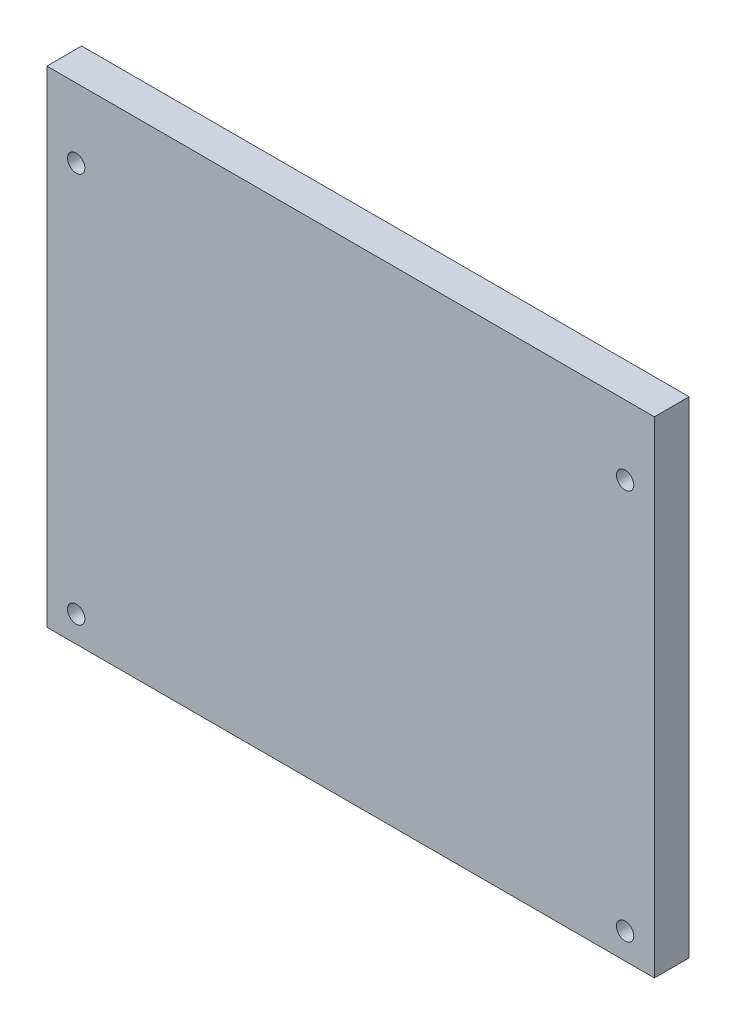
ISO-10303-21;
HEADER;
FILE_DESCRIPTION(('STEP AP214'),'2;1');
FILE_NAME('part.step','',(''),(''),'','','');
FILE_SCHEMA(('AUTOMOTIVE_DESIGN { 1 0 10303 214 1 1 1 1 }'));
ENDSEC;
DATA;
#1=APPLICATION_CONTEXT('core data for automotive mechanical design processes');
#2=APPLICATION_PROTOCOL_DEFINITION('international standard','automotive_design',2000,#1);
#3=PRODUCT_CONTEXT('',#1,'mechanical');
#4=PRODUCT('Part','Part','',(#3));
#5=PRODUCT_RELATED_PRODUCT_CATEGORY('part','',(#4));
#6=PRODUCT_DEFINITION_FORMATION('','',#4);
#7=PRODUCT_DEFINITION_CONTEXT('part definition',#1,'design');
#8=PRODUCT_DEFINITION('design','',#6,#7);
#9=PRODUCT_DEFINITION_SHAPE('','',#8);
#10=(LENGTH_UNIT() NAMED_UNIT(*) SI_UNIT(.MILLI.,.METRE.));
#11=(NAMED_UNIT(*) PLANE_ANGLE_UNIT() SI_UNIT($,.RADIAN.));
#12=(NAMED_UNIT(*) SI_UNIT($,.STERADIAN.) SOLID_ANGLE_UNIT());
#13=UNCERTAINTY_MEASURE_WITH_UNIT(LENGTH_MEASURE(1.E-05),#10,'distance_accuracy_value','');
#14=(GEOMETRIC_REPRESENTATION_CONTEXT(3) GLOBAL_UNCERTAINTY_ASSIGNED_CONTEXT((#13)) GLOBAL_UNIT_ASSIGNED_CONTEXT((#10,
#11,#12)) REPRESENTATION_CONTEXT('',''));
#15=CARTESIAN_POINT('',(0.,0.,0.));
#16=DIRECTION('',(0.,0.,1.));
#17=DIRECTION('',(1.,0.,0.));
#18=AXIS2_PLACEMENT_3D('',#15,#16,#17);
#19=CARTESIAN_POINT('',(0.,0.,25.4));
#20=DIRECTION('',(1.,0.,0.));
#21=DIRECTION('',(0.,0.,-1.));
#22=AXIS2_PLACEMENT_3D('',#19,#20,#21);
#23=PLANE('',#22);
#24=DIRECTION('',(0.,-1.,0.));
#25=VECTOR('',#24,1.);
#26=CARTESIAN_POINT('',(0.,0.,0.));
#27=LINE('',#26,#25);
#28=CARTESIAN_POINT('',(0.,355.6,0.));
#29=VERTEX_POINT('',#28);
#30=CARTESIAN_POINT('',(0.,0.,0.));
#31=VERTEX_POINT('',#30);
#32=EDGE_CURVE('E102',#29,#31,#27,.T.);
#33=ORIENTED_EDGE('',*,*,#32,.T.);
#34=DIRECTION('',(0.,0.,-1.));
#35=VECTOR('',#34,1.);
#36=CARTESIAN_POINT('',(0.,0.,25.4));
#37=LINE('',#36,#35);
#38=CARTESIAN_POINT('',(0.,0.,25.4));
#39=VERTEX_POINT('',#38);
#40=EDGE_CURVE('E11',#39,#31,#37,.T.);
#41=ORIENTED_EDGE('',*,*,#40,.F.);
#42=DIRECTION('',(0.,-1.,0.));
#43=VECTOR('',#42,1.);
#44=CARTESIAN_POINT('',(0.,0.,25.4));
#45=LINE('',#44,#43);
#46=CARTESIAN_POINT('',(0.,355.6,25.4));
#47=VERTEX_POINT('',#46);
#48=EDGE_CURVE('E90',#47,#39,#45,.T.);
#49=ORIENTED_EDGE('',*,*,#48,.F.);
#50=DIRECTION('',(0.,0.,-1.));
#51=VECTOR('',#50,1.);
#52=CARTESIAN_POINT('',(0.,355.6,25.4));
#53=LINE('',#52,#51);
#54=EDGE_CURVE('E98',#47,#29,#53,.T.);
#55=ORIENTED_EDGE('',*,*,#54,.T.);
#56=EDGE_LOOP('',(#33,#41,#49,#55));
#57=FACE_BOUND('',#56,.T.);
#58=ADVANCED_FACE('F39',(#57),#23,.F.);
#59=CARTESIAN_POINT('',(0.,0.,25.4));
#60=DIRECTION('',(0.,1.,0.));
#61=DIRECTION('',(0.,0.,1.));
#62=AXIS2_PLACEMENT_3D('',#59,#60,#61);
#63=PLANE('',#62);
#64=DIRECTION('',(1.,0.,0.));
#65=VECTOR('',#64,1.);
#66=CARTESIAN_POINT('',(0.,0.,0.));
#67=LINE('',#66,#65);
#68=CARTESIAN_POINT('',(444.5,0.,0.));
#69=VERTEX_POINT('',#68);
#70=EDGE_CURVE('E94',#31,#69,#67,.T.);
#71=ORIENTED_EDGE('',*,*,#70,.T.);
#72=DIRECTION('',(0.,0.,-1.));
#73=VECTOR('',#72,1.);
#74=CARTESIAN_POINT('',(444.5,0.,25.4));
#75=LINE('',#74,#73);
#76=CARTESIAN_POINT('',(444.5,0.,25.4));
#77=VERTEX_POINT('',#76);
#78=EDGE_CURVE('E47',#77,#69,#75,.T.);
#79=ORIENTED_EDGE('',*,*,#78,.F.);
#80=DIRECTION('',(1.,0.,0.));
#81=VECTOR('',#80,1.);
#82=CARTESIAN_POINT('',(0.,0.,25.4));
#83=LINE('',#82,#81);
#84=EDGE_CURVE('E85',#39,#77,#83,.T.);
#85=ORIENTED_EDGE('',*,*,#84,.F.);
#86=ORIENTED_EDGE('',*,*,#40,.T.);
#87=EDGE_LOOP('',(#71,#79,#85,#86));
#88=FACE_BOUND('',#87,.T.);
#89=ADVANCED_FACE('F93',(#88),#63,.F.);
#90=CARTESIAN_POINT('',(444.5,0.,25.4));
#91=DIRECTION('',(-1.,0.,0.));
#92=DIRECTION('',(0.,0.,1.));
#93=AXIS2_PLACEMENT_3D('',#90,#91,#92);
#94=PLANE('',#93);
#95=DIRECTION('',(0.,1.,0.));
#96=VECTOR('',#95,1.);
#97=CARTESIAN_POINT('',(444.5,0.,0.));
#98=LINE('',#97,#96);
#99=CARTESIAN_POINT('',(444.5,355.6,0.));
#100=VERTEX_POINT('',#99);
#101=EDGE_CURVE('E72',#69,#100,#98,.T.);
#102=ORIENTED_EDGE('',*,*,#101,.T.);
#103=DIRECTION('',(0.,0.,-1.));
#104=VECTOR('',#103,1.);
#105=CARTESIAN_POINT('',(444.5,355.6,25.4));
#106=LINE('',#105,#104);
#107=CARTESIAN_POINT('',(444.5,355.6,25.4));
#108=VERTEX_POINT('',#107);
#109=EDGE_CURVE('E95',#108,#100,#106,.T.);
#110=ORIENTED_EDGE('',*,*,#109,.F.);
#111=DIRECTION('',(0.,1.,0.));
#112=VECTOR('',#111,1.);
#113=CARTESIAN_POINT('',(444.5,0.,25.4));
#114=LINE('',#113,#112);
#115=EDGE_CURVE('E88',#77,#108,#114,.T.);
#116=ORIENTED_EDGE('',*,*,#115,.F.);
#117=ORIENTED_EDGE('',*,*,#78,.T.);
#118=EDGE_LOOP('',(#102,#110,#116,#117));
#119=FACE_BOUND('',#118,.T.);
#120=ADVANCED_FACE('F96',(#119),#94,.F.);
#121=CARTESIAN_POINT('',(0.,355.6,25.4));
#122=DIRECTION('',(0.,-1.,0.));
#123=DIRECTION('',(0.,0.,-1.));
#124=AXIS2_PLACEMENT_3D('',#121,#122,#123);
#125=PLANE('',#124);
#126=DIRECTION('',(-1.,0.,0.));
#127=VECTOR('',#126,1.);
#128=CARTESIAN_POINT('',(0.,355.6,0.));
#129=LINE('',#128,#127);
#130=EDGE_CURVE('E78',#100,#29,#129,.T.);
#131=ORIENTED_EDGE('',*,*,#130,.T.);
#132=ORIENTED_EDGE('',*,*,#54,.F.);
#133=DIRECTION('',(-1.,0.,0.));
#134=VECTOR('',#133,1.);
#135=CARTESIAN_POINT('',(0.,355.6,25.4));
#136=LINE('',#135,#134);
#137=EDGE_CURVE('E55',#108,#47,#136,.T.);
#138=ORIENTED_EDGE('',*,*,#137,.F.);
#139=ORIENTED_EDGE('',*,*,#109,.T.);
#140=EDGE_LOOP('',(#131,#132,#138,#139));
#141=FACE_BOUND('',#140,.T.);
#142=ADVANCED_FACE('F110',(#141),#125,.F.);
#143=CARTESIAN_POINT('',(0.,0.,25.4));
#144=DIRECTION('',(0.,0.,-1.));
#145=DIRECTION('',(-1.,0.,0.));
#146=AXIS2_PLACEMENT_3D('',#143,#144,#145);
#147=PLANE('',#146);
#148=CARTESIAN_POINT('',(423.0624,19.05,25.4));
#149=DIRECTION('',(0.,0.,1.));
#150=DIRECTION('',(1.,0.,0.));
#151=AXIS2_PLACEMENT_3D('',#148,#149,#150);
#152=CIRCLE('',#151,6.35);
#153=CARTESIAN_POINT('',(429.4124,19.05,25.4));
#154=VERTEX_POINT('',#153);
#155=EDGE_CURVE('E129',#154,#154,#152,.T.);
#156=ORIENTED_EDGE('',*,*,#155,.F.);
#157=EDGE_LOOP('',(#156));
#158=FACE_BOUND('',#157,.T.);
#159=CARTESIAN_POINT('',(21.4376,304.8,25.4));
#160=DIRECTION('',(0.,0.,1.));
#161=DIRECTION('',(1.,0.,0.));
#162=AXIS2_PLACEMENT_3D('',#159,#160,#161);
#163=CIRCLE('',#162,6.35);
#164=CARTESIAN_POINT('',(27.7876,304.8,25.4));
#165=VERTEX_POINT('',#164);
#166=EDGE_CURVE('E122',#165,#165,#163,.T.);
#167=ORIENTED_EDGE('',*,*,#166,.F.);
#168=EDGE_LOOP('',(#167));
#169=FACE_BOUND('',#168,.T.);
#170=CARTESIAN_POINT('',(423.0624,304.8,25.4));
#171=DIRECTION('',(0.,0.,1.));
#172=DIRECTION('',(1.,0.,0.));
#173=AXIS2_PLACEMENT_3D('',#170,#171,#172);
#174=CIRCLE('',#173,6.34999999999999);
#175=CARTESIAN_POINT('',(429.4124,304.8,25.4));
#176=VERTEX_POINT('',#175);
#177=EDGE_CURVE('E134',#176,#176,#174,.T.);
#178=ORIENTED_EDGE('',*,*,#177,.F.);
#179=EDGE_LOOP('',(#178));
#180=FACE_BOUND('',#179,.T.);
#181=CARTESIAN_POINT('',(21.4376,19.05,25.4));
#182=DIRECTION('',(0.,0.,1.));
#183=DIRECTION('',(1.,0.,0.));
#184=AXIS2_PLACEMENT_3D('',#181,#182,#183);
#185=CIRCLE('',#184,6.35);
#186=CARTESIAN_POINT('',(27.7876,19.05,25.4));
#187=VERTEX_POINT('',#186);
#188=EDGE_CURVE('E105',#187,#187,#185,.T.);
#189=ORIENTED_EDGE('',*,*,#188,.F.);
#190=EDGE_LOOP('',(#189));
#191=FACE_BOUND('',#190,.T.);
#192=ORIENTED_EDGE('',*,*,#48,.T.);
#193=ORIENTED_EDGE('',*,*,#84,.T.);
#194=ORIENTED_EDGE('',*,*,#115,.T.);
#195=ORIENTED_EDGE('',*,*,#137,.T.);
#196=EDGE_LOOP('',(#192,#193,#194,#195));
#197=FACE_BOUND('',#196,.T.);
#198=ADVANCED_FACE('F86',(#158,#169,#180,#191,#197),#147,.F.);
#199=CARTESIAN_POINT('',(0.,0.,0.));
#200=DIRECTION('',(0.,0.,-1.));
#201=DIRECTION('',(-1.,0.,0.));
#202=AXIS2_PLACEMENT_3D('',#199,#200,#201);
#203=PLANE('',#202);
#204=CARTESIAN_POINT('',(423.0624,19.05,0.));
#205=DIRECTION('',(0.,0.,1.));
#206=DIRECTION('',(1.,0.,0.));
#207=AXIS2_PLACEMENT_3D('',#204,#205,#206);
#208=CIRCLE('',#207,6.35);
#209=CARTESIAN_POINT('',(429.4124,19.05,0.));
#210=VERTEX_POINT('',#209);
#211=EDGE_CURVE('E119',#210,#210,#208,.T.);
#212=ORIENTED_EDGE('',*,*,#211,.T.);
#213=EDGE_LOOP('',(#212));
#214=FACE_BOUND('',#213,.T.);
#215=CARTESIAN_POINT('',(21.4376,304.8,0.));
#216=DIRECTION('',(0.,0.,1.));
#217=DIRECTION('',(1.,0.,0.));
#218=AXIS2_PLACEMENT_3D('',#215,#216,#217);
#219=CIRCLE('',#218,6.35);
#220=CARTESIAN_POINT('',(27.7876,304.8,0.));
#221=VERTEX_POINT('',#220);
#222=EDGE_CURVE('E125',#221,#221,#219,.T.);
#223=ORIENTED_EDGE('',*,*,#222,.T.);
#224=EDGE_LOOP('',(#223));
#225=FACE_BOUND('',#224,.T.);
#226=CARTESIAN_POINT('',(423.0624,304.8,0.));
#227=DIRECTION('',(0.,0.,1.));
#228=DIRECTION('',(1.,0.,0.));
#229=AXIS2_PLACEMENT_3D('',#226,#227,#228);
#230=CIRCLE('',#229,6.34999999999999);
#231=CARTESIAN_POINT('',(429.4124,304.8,0.));
#232=VERTEX_POINT('',#231);
#233=EDGE_CURVE('E126',#232,#232,#230,.T.);
#234=ORIENTED_EDGE('',*,*,#233,.T.);
#235=EDGE_LOOP('',(#234));
#236=FACE_BOUND('',#235,.T.);
#237=CARTESIAN_POINT('',(21.4376,19.05,0.));
#238=DIRECTION('',(0.,0.,1.));
#239=DIRECTION('',(1.,0.,0.));
#240=AXIS2_PLACEMENT_3D('',#237,#238,#239);
#241=CIRCLE('',#240,6.35);
#242=CARTESIAN_POINT('',(27.7876,19.05,0.));
#243=VERTEX_POINT('',#242);
#244=EDGE_CURVE('E116',#243,#243,#241,.T.);
#245=ORIENTED_EDGE('',*,*,#244,.T.);
#246=EDGE_LOOP('',(#245));
#247=FACE_BOUND('',#246,.T.);
#248=ORIENTED_EDGE('',*,*,#32,.F.);
#249=ORIENTED_EDGE('',*,*,#130,.F.);
#250=ORIENTED_EDGE('',*,*,#101,.F.);
#251=ORIENTED_EDGE('',*,*,#70,.F.);
#252=EDGE_LOOP('',(#248,#249,#250,#251));
#253=FACE_BOUND('',#252,.T.);
#254=ADVANCED_FACE('F113',(#214,#225,#236,#247,#253),#203,.T.);
#255=CARTESIAN_POINT('',(21.4376,19.05,25.4));
#256=DIRECTION('',(0.,0.,-1.));
#257=DIRECTION('',(-1.,0.,0.));
#258=AXIS2_PLACEMENT_3D('',#255,#256,#257);
#259=CYLINDRICAL_SURFACE('',#258,6.35);
#260=ORIENTED_EDGE('',*,*,#188,.T.);
#261=EDGE_LOOP('',(#260));
#262=FACE_BOUND('',#261,.T.);
#263=ORIENTED_EDGE('',*,*,#244,.F.);
#264=EDGE_LOOP('',(#263));
#265=FACE_BOUND('',#264,.T.);
#266=ADVANCED_FACE('F145',(#262,#265),#259,.F.);
#267=CARTESIAN_POINT('',(423.0624,304.8,25.4));
#268=DIRECTION('',(0.,0.,-1.));
#269=DIRECTION('',(-1.,0.,0.));
#270=AXIS2_PLACEMENT_3D('',#267,#268,#269);
#271=CYLINDRICAL_SURFACE('',#270,6.34999999999999);
#272=ORIENTED_EDGE('',*,*,#177,.T.);
#273=EDGE_LOOP('',(#272));
#274=FACE_BOUND('',#273,.T.);
#275=ORIENTED_EDGE('',*,*,#233,.F.);
#276=EDGE_LOOP('',(#275));
#277=FACE_BOUND('',#276,.T.);
#278=ADVANCED_FACE('F142',(#274,#277),#271,.F.);
#279=CARTESIAN_POINT('',(21.4376,304.8,25.4));
#280=DIRECTION('',(0.,0.,-1.));
#281=DIRECTION('',(-1.,0.,0.));
#282=AXIS2_PLACEMENT_3D('',#279,#280,#281);
#283=CYLINDRICAL_SURFACE('',#282,6.35);
#284=ORIENTED_EDGE('',*,*,#166,.T.);
#285=EDGE_LOOP('',(#284));
#286=FACE_BOUND('',#285,.T.);
#287=ORIENTED_EDGE('',*,*,#222,.F.);
#288=EDGE_LOOP('',(#287));
#289=FACE_BOUND('',#288,.T.);
#290=ADVANCED_FACE('F144',(#286,#289),#283,.F.);
#291=CARTESIAN_POINT('',(423.0624,19.05,25.4));
#292=DIRECTION('',(0.,0.,-1.));
#293=DIRECTION('',(-1.,0.,0.));
#294=AXIS2_PLACEMENT_3D('',#291,#292,#293);
#295=CYLINDRICAL_SURFACE('',#294,6.35);
#296=ORIENTED_EDGE('',*,*,#155,.T.);
#297=EDGE_LOOP('',(#296));
#298=FACE_BOUND('',#297,.T.);
#299=ORIENTED_EDGE('',*,*,#211,.F.);
#300=EDGE_LOOP('',(#299));
#301=FACE_BOUND('',#300,.T.);
#302=ADVANCED_FACE('F152',(#298,#301),#295,.F.);
#303=CLOSED_SHELL('',(#58,#89,#120,#142,#198,#254,#266,#278,#290,#302));
#304=MANIFOLD_SOLID_BREP('B2',#303);
#305=ADVANCED_BREP_SHAPE_REPRESENTATION('',(#18,#304),#14);
#306=SHAPE_DEFINITION_REPRESENTATION(#9,#305);
ENDSEC;
END-ISO-10303-21;
